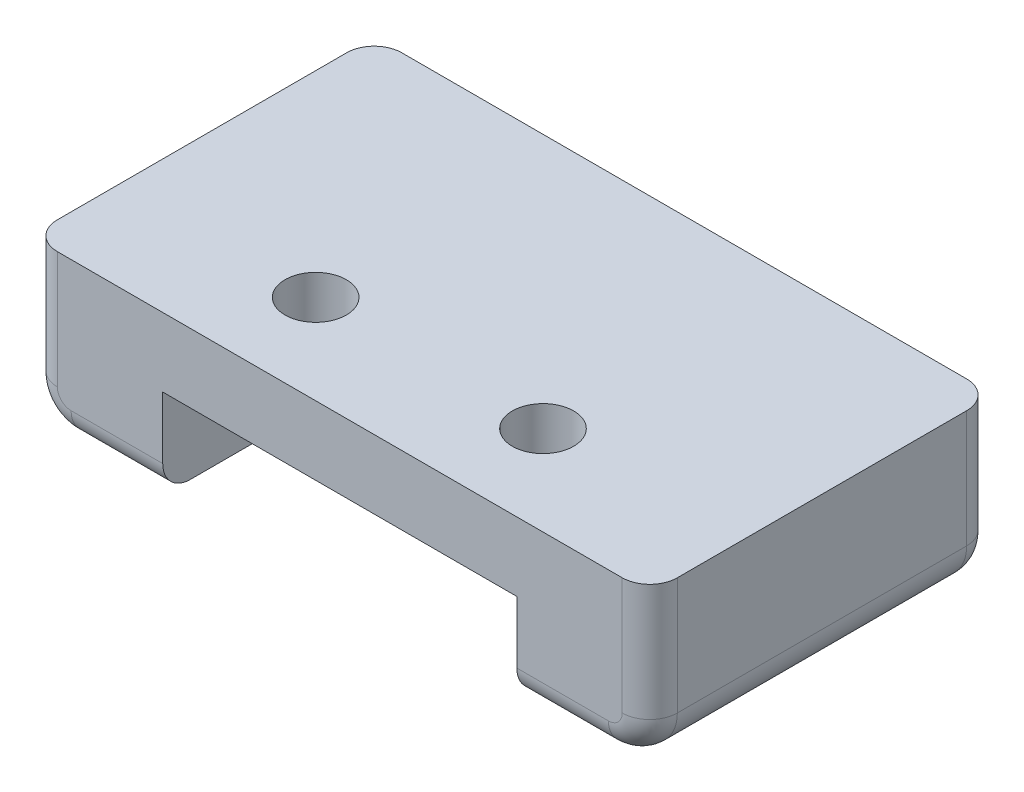
ISO-10303-21;
HEADER;
FILE_DESCRIPTION(('STEP AP214'),'2;1');
FILE_NAME('part.step','',(''),(''),'','','');
FILE_SCHEMA(('AUTOMOTIVE_DESIGN { 1 0 10303 214 1 1 1 1 }'));
ENDSEC;
DATA;
#1=APPLICATION_CONTEXT('core data for automotive mechanical design processes');
#2=APPLICATION_PROTOCOL_DEFINITION('international standard','automotive_design',2000,#1);
#3=PRODUCT_CONTEXT('',#1,'mechanical');
#4=PRODUCT('Part','Part','',(#3));
#5=PRODUCT_RELATED_PRODUCT_CATEGORY('part','',(#4));
#6=PRODUCT_DEFINITION_FORMATION('','',#4);
#7=PRODUCT_DEFINITION_CONTEXT('part definition',#1,'design');
#8=PRODUCT_DEFINITION('design','',#6,#7);
#9=PRODUCT_DEFINITION_SHAPE('','',#8);
#10=(LENGTH_UNIT() NAMED_UNIT(*) SI_UNIT(.MILLI.,.METRE.));
#11=(NAMED_UNIT(*) PLANE_ANGLE_UNIT() SI_UNIT($,.RADIAN.));
#12=(NAMED_UNIT(*) SI_UNIT($,.STERADIAN.) SOLID_ANGLE_UNIT());
#13=UNCERTAINTY_MEASURE_WITH_UNIT(LENGTH_MEASURE(1.E-05),#10,'distance_accuracy_value','');
#14=(GEOMETRIC_REPRESENTATION_CONTEXT(3) GLOBAL_UNCERTAINTY_ASSIGNED_CONTEXT((#13)) GLOBAL_UNIT_ASSIGNED_CONTEXT((#10,
#11,#12)) REPRESENTATION_CONTEXT('',''));
#15=CARTESIAN_POINT('',(0.,0.,0.));
#16=DIRECTION('',(0.,0.,1.));
#17=DIRECTION('',(1.,0.,0.));
#18=AXIS2_PLACEMENT_3D('',#15,#16,#17);
#19=CARTESIAN_POINT('',(-22.5,-6.5,25.));
#20=DIRECTION('',(1.,0.,0.));
#21=DIRECTION('',(0.,0.,-1.));
#22=AXIS2_PLACEMENT_3D('',#19,#20,#21);
#23=PLANE('',#22);
#24=DIRECTION('',(0.,0.,-1.));
#25=VECTOR('',#24,1.);
#26=CARTESIAN_POINT('',(-22.5,-3.5,25.));
#27=LINE('',#26,#25);
#28=CARTESIAN_POINT('',(-22.5,-3.5,2.));
#29=VERTEX_POINT('',#28);
#30=CARTESIAN_POINT('',(-22.5,-3.5,23.));
#31=VERTEX_POINT('',#30);
#32=EDGE_CURVE('E223',#29,#31,#27,.F.);
#33=ORIENTED_EDGE('',*,*,#32,.T.);
#34=DIRECTION('',(0.,-1.,0.));
#35=VECTOR('',#34,1.);
#36=CARTESIAN_POINT('',(-22.5,-6.5,23.));
#37=LINE('',#36,#35);
#38=CARTESIAN_POINT('',(-22.5,4.99999999999999,23.));
#39=VERTEX_POINT('',#38);
#40=EDGE_CURVE('E11',#31,#39,#37,.F.);
#41=ORIENTED_EDGE('',*,*,#40,.T.);
#42=DIRECTION('',(0.,0.,-1.));
#43=VECTOR('',#42,1.);
#44=CARTESIAN_POINT('',(-22.5,4.99999999999999,25.));
#45=LINE('',#44,#43);
#46=CARTESIAN_POINT('',(-22.5,4.99999999999999,2.));
#47=VERTEX_POINT('',#46);
#48=EDGE_CURVE('E195',#39,#47,#45,.T.);
#49=ORIENTED_EDGE('',*,*,#48,.T.);
#50=DIRECTION('',(0.,-1.,0.));
#51=VECTOR('',#50,1.);
#52=CARTESIAN_POINT('',(-22.5,-3.5,2.));
#53=LINE('',#52,#51);
#54=EDGE_CURVE('E43',#47,#29,#53,.T.);
#55=ORIENTED_EDGE('',*,*,#54,.T.);
#56=EDGE_LOOP('',(#33,#41,#49,#55));
#57=FACE_BOUND('',#56,.T.);
#58=ADVANCED_FACE('F34',(#57),#23,.F.);
#59=CARTESIAN_POINT('',(-12.85,-6.5,25.));
#60=DIRECTION('',(0.,1.,0.));
#61=DIRECTION('',(-1.,0.,0.));
#62=AXIS2_PLACEMENT_3D('',#59,#60,#61);
#63=PLANE('',#62);
#64=DIRECTION('',(0.,0.,-1.));
#65=VECTOR('',#64,1.);
#66=CARTESIAN_POINT('',(-12.85,-6.5,25.));
#67=LINE('',#66,#65);
#68=CARTESIAN_POINT('',(-12.85,-6.5,23.));
#69=VERTEX_POINT('',#68);
#70=CARTESIAN_POINT('',(-12.85,-6.5,2.));
#71=VERTEX_POINT('',#70);
#72=EDGE_CURVE('E181',#69,#71,#67,.T.);
#73=ORIENTED_EDGE('',*,*,#72,.F.);
#74=DIRECTION('',(1.,0.,0.));
#75=VECTOR('',#74,1.);
#76=CARTESIAN_POINT('',(-12.85,-6.5,23.));
#77=LINE('',#76,#75);
#78=CARTESIAN_POINT('',(-19.5,-6.5,23.));
#79=VERTEX_POINT('',#78);
#80=EDGE_CURVE('E258',#69,#79,#77,.F.);
#81=ORIENTED_EDGE('',*,*,#80,.T.);
#82=DIRECTION('',(0.,0.,-1.));
#83=VECTOR('',#82,1.);
#84=CARTESIAN_POINT('',(-19.5,-6.5,25.));
#85=LINE('',#84,#83);
#86=CARTESIAN_POINT('',(-19.5,-6.5,2.));
#87=VERTEX_POINT('',#86);
#88=EDGE_CURVE('E220',#79,#87,#85,.T.);
#89=ORIENTED_EDGE('',*,*,#88,.T.);
#90=DIRECTION('',(1.,0.,0.));
#91=VECTOR('',#90,1.);
#92=CARTESIAN_POINT('',(-12.85,-6.5,2.));
#93=LINE('',#92,#91);
#94=EDGE_CURVE('E255',#87,#71,#93,.T.);
#95=ORIENTED_EDGE('',*,*,#94,.T.);
#96=EDGE_LOOP('',(#73,#81,#89,#95));
#97=FACE_BOUND('',#96,.T.);
#98=ADVANCED_FACE('F341',(#97),#63,.F.);
#99=CARTESIAN_POINT('',(-12.85,0.,25.));
#100=DIRECTION('',(-1.,0.,0.));
#101=DIRECTION('',(0.,0.,1.));
#102=AXIS2_PLACEMENT_3D('',#99,#100,#101);
#103=PLANE('',#102);
#104=DIRECTION('',(0.,1.,0.));
#105=VECTOR('',#104,1.);
#106=CARTESIAN_POINT('',(-12.85,0.,25.));
#107=LINE('',#106,#105);
#108=CARTESIAN_POINT('',(-12.85,-4.5,25.));
#109=VERTEX_POINT('',#108);
#110=CARTESIAN_POINT('',(-12.85,0.,25.));
#111=VERTEX_POINT('',#110);
#112=EDGE_CURVE('E162',#109,#111,#107,.T.);
#113=ORIENTED_EDGE('',*,*,#112,.F.);
#114=CARTESIAN_POINT('',(-12.85,-4.5,23.));
#115=DIRECTION('',(-1.,0.,0.));
#116=DIRECTION('',(0.,0.,1.));
#117=AXIS2_PLACEMENT_3D('',#114,#115,#116);
#118=CIRCLE('',#117,2.);
#119=EDGE_CURVE('E253',#109,#69,#118,.F.);
#120=ORIENTED_EDGE('',*,*,#119,.T.);
#121=ORIENTED_EDGE('',*,*,#72,.T.);
#122=CARTESIAN_POINT('',(-12.85,-4.5,2.));
#123=DIRECTION('',(-1.,0.,0.));
#124=DIRECTION('',(0.,0.,1.));
#125=AXIS2_PLACEMENT_3D('',#122,#123,#124);
#126=CIRCLE('',#125,2.);
#127=CARTESIAN_POINT('',(-12.85,-4.5,0.));
#128=VERTEX_POINT('',#127);
#129=EDGE_CURVE('E251',#71,#128,#126,.F.);
#130=ORIENTED_EDGE('',*,*,#129,.T.);
#131=DIRECTION('',(0.,1.,0.));
#132=VECTOR('',#131,1.);
#133=CARTESIAN_POINT('',(-12.85,0.,0.));
#134=LINE('',#133,#132);
#135=CARTESIAN_POINT('',(-12.85,0.,0.));
#136=VERTEX_POINT('',#135);
#137=EDGE_CURVE('E178',#128,#136,#134,.T.);
#138=ORIENTED_EDGE('',*,*,#137,.T.);
#139=DIRECTION('',(0.,0.,-1.));
#140=VECTOR('',#139,1.);
#141=CARTESIAN_POINT('',(-12.85,0.,25.));
#142=LINE('',#141,#140);
#143=EDGE_CURVE('E175',#111,#136,#142,.T.);
#144=ORIENTED_EDGE('',*,*,#143,.F.);
#145=EDGE_LOOP('',(#113,#120,#121,#130,#138,#144));
#146=FACE_BOUND('',#145,.T.);
#147=ADVANCED_FACE('F176',(#146),#103,.F.);
#148=CARTESIAN_POINT('',(12.85,0.,25.));
#149=DIRECTION('',(0.,1.,0.));
#150=DIRECTION('',(0.,0.,1.));
#151=AXIS2_PLACEMENT_3D('',#148,#149,#150);
#152=PLANE('',#151);
#153=CARTESIAN_POINT('',(8.25,0.,18.5));
#154=DIRECTION('',(0.,1.,0.));
#155=DIRECTION('',(0.,0.,1.));
#156=AXIS2_PLACEMENT_3D('',#153,#154,#155);
#157=CIRCLE('',#156,2.225);
#158=CARTESIAN_POINT('',(8.25,0.,20.725));
#159=VERTEX_POINT('',#158);
#160=EDGE_CURVE('E607',#159,#159,#157,.T.);
#161=ORIENTED_EDGE('',*,*,#160,.T.);
#162=EDGE_LOOP('',(#161));
#163=FACE_BOUND('',#162,.T.);
#164=CARTESIAN_POINT('',(-8.25,0.,18.5));
#165=DIRECTION('',(0.,1.,0.));
#166=DIRECTION('',(0.,0.,1.));
#167=AXIS2_PLACEMENT_3D('',#164,#165,#166);
#168=CIRCLE('',#167,2.225);
#169=CARTESIAN_POINT('',(-8.25,0.,20.725));
#170=VERTEX_POINT('',#169);
#171=EDGE_CURVE('E198',#170,#170,#168,.T.);
#172=ORIENTED_EDGE('',*,*,#171,.T.);
#173=EDGE_LOOP('',(#172));
#174=FACE_BOUND('',#173,.T.);
#175=DIRECTION('',(1.,0.,0.));
#176=VECTOR('',#175,1.);
#177=CARTESIAN_POINT('',(12.85,0.,0.));
#178=LINE('',#177,#176);
#179=CARTESIAN_POINT('',(12.85,0.,0.));
#180=VERTEX_POINT('',#179);
#181=EDGE_CURVE('E197',#136,#180,#178,.T.);
#182=ORIENTED_EDGE('',*,*,#181,.T.);
#183=DIRECTION('',(0.,0.,-1.));
#184=VECTOR('',#183,1.);
#185=CARTESIAN_POINT('',(12.85,0.,25.));
#186=LINE('',#185,#184);
#187=CARTESIAN_POINT('',(12.85,0.,25.));
#188=VERTEX_POINT('',#187);
#189=EDGE_CURVE('E182',#188,#180,#186,.T.);
#190=ORIENTED_EDGE('',*,*,#189,.F.);
#191=DIRECTION('',(1.,0.,0.));
#192=VECTOR('',#191,1.);
#193=CARTESIAN_POINT('',(12.85,0.,25.));
#194=LINE('',#193,#192);
#195=EDGE_CURVE('E167',#111,#188,#194,.T.);
#196=ORIENTED_EDGE('',*,*,#195,.F.);
#197=ORIENTED_EDGE('',*,*,#143,.T.);
#198=EDGE_LOOP('',(#182,#190,#196,#197));
#199=FACE_BOUND('',#198,.T.);
#200=ADVANCED_FACE('F184',(#163,#174,#199),#152,.F.);
#201=CARTESIAN_POINT('',(12.85,-6.5,25.));
#202=DIRECTION('',(1.,0.,0.));
#203=DIRECTION('',(0.,0.,-1.));
#204=AXIS2_PLACEMENT_3D('',#201,#202,#203);
#205=PLANE('',#204);
#206=DIRECTION('',(0.,0.,-1.));
#207=VECTOR('',#206,1.);
#208=CARTESIAN_POINT('',(12.85,-6.5,25.));
#209=LINE('',#208,#207);
#210=CARTESIAN_POINT('',(12.85,-6.5,23.));
#211=VERTEX_POINT('',#210);
#212=CARTESIAN_POINT('',(12.85,-6.5,2.));
#213=VERTEX_POINT('',#212);
#214=EDGE_CURVE('E209',#211,#213,#209,.T.);
#215=ORIENTED_EDGE('',*,*,#214,.F.);
#216=CARTESIAN_POINT('',(12.85,-4.5,23.));
#217=DIRECTION('',(1.,0.,0.));
#218=DIRECTION('',(0.,0.,-1.));
#219=AXIS2_PLACEMENT_3D('',#216,#217,#218);
#220=CIRCLE('',#219,2.);
#221=CARTESIAN_POINT('',(12.85,-4.5,25.));
#222=VERTEX_POINT('',#221);
#223=EDGE_CURVE('E245',#211,#222,#220,.F.);
#224=ORIENTED_EDGE('',*,*,#223,.T.);
#225=DIRECTION('',(0.,-1.,0.));
#226=VECTOR('',#225,1.);
#227=CARTESIAN_POINT('',(12.85,-6.5,25.));
#228=LINE('',#227,#226);
#229=EDGE_CURVE('E187',#188,#222,#228,.T.);
#230=ORIENTED_EDGE('',*,*,#229,.F.);
#231=ORIENTED_EDGE('',*,*,#189,.T.);
#232=DIRECTION('',(0.,-1.,0.));
#233=VECTOR('',#232,1.);
#234=CARTESIAN_POINT('',(12.85,-6.5,0.));
#235=LINE('',#234,#233);
#236=CARTESIAN_POINT('',(12.85,-4.5,0.));
#237=VERTEX_POINT('',#236);
#238=EDGE_CURVE('E200',#180,#237,#235,.T.);
#239=ORIENTED_EDGE('',*,*,#238,.T.);
#240=CARTESIAN_POINT('',(12.85,-4.5,2.));
#241=DIRECTION('',(1.,0.,0.));
#242=DIRECTION('',(0.,0.,-1.));
#243=AXIS2_PLACEMENT_3D('',#240,#241,#242);
#244=CIRCLE('',#243,2.);
#245=EDGE_CURVE('E243',#237,#213,#244,.F.);
#246=ORIENTED_EDGE('',*,*,#245,.T.);
#247=EDGE_LOOP('',(#215,#224,#230,#231,#239,#246));
#248=FACE_BOUND('',#247,.T.);
#249=ADVANCED_FACE('F380',(#248),#205,.F.);
#250=CARTESIAN_POINT('',(22.5,-6.5,25.));
#251=DIRECTION('',(0.,1.,0.));
#252=DIRECTION('',(-1.,0.,0.));
#253=AXIS2_PLACEMENT_3D('',#250,#251,#252);
#254=PLANE('',#253);
#255=DIRECTION('',(0.,0.,-1.));
#256=VECTOR('',#255,1.);
#257=CARTESIAN_POINT('',(19.5,-6.5,25.));
#258=LINE('',#257,#256);
#259=CARTESIAN_POINT('',(19.5,-6.5,2.));
#260=VERTEX_POINT('',#259);
#261=CARTESIAN_POINT('',(19.5,-6.5,23.));
#262=VERTEX_POINT('',#261);
#263=EDGE_CURVE('E217',#260,#262,#258,.F.);
#264=ORIENTED_EDGE('',*,*,#263,.T.);
#265=DIRECTION('',(1.,0.,0.));
#266=VECTOR('',#265,1.);
#267=CARTESIAN_POINT('',(22.5,-6.5,23.));
#268=LINE('',#267,#266);
#269=EDGE_CURVE('E241',#262,#211,#268,.F.);
#270=ORIENTED_EDGE('',*,*,#269,.T.);
#271=ORIENTED_EDGE('',*,*,#214,.T.);
#272=DIRECTION('',(1.,0.,0.));
#273=VECTOR('',#272,1.);
#274=CARTESIAN_POINT('',(19.5,-6.5,2.));
#275=LINE('',#274,#273);
#276=EDGE_CURVE('E238',#213,#260,#275,.T.);
#277=ORIENTED_EDGE('',*,*,#276,.T.);
#278=EDGE_LOOP('',(#264,#270,#271,#277));
#279=FACE_BOUND('',#278,.T.);
#280=ADVANCED_FACE('F373',(#279),#254,.F.);
#281=CARTESIAN_POINT('',(22.5,4.99999999999999,25.));
#282=DIRECTION('',(-1.,0.,0.));
#283=DIRECTION('',(0.,0.,1.));
#284=AXIS2_PLACEMENT_3D('',#281,#282,#283);
#285=PLANE('',#284);
#286=DIRECTION('',(0.,0.,-1.));
#287=VECTOR('',#286,1.);
#288=CARTESIAN_POINT('',(22.5,4.99999999999999,25.));
#289=LINE('',#288,#287);
#290=CARTESIAN_POINT('',(22.5,4.99999999999999,23.));
#291=VERTEX_POINT('',#290);
#292=CARTESIAN_POINT('',(22.5,4.99999999999999,2.));
#293=VERTEX_POINT('',#292);
#294=EDGE_CURVE('E207',#291,#293,#289,.T.);
#295=ORIENTED_EDGE('',*,*,#294,.F.);
#296=DIRECTION('',(0.,1.,0.));
#297=VECTOR('',#296,1.);
#298=CARTESIAN_POINT('',(22.5,4.99999999999999,23.));
#299=LINE('',#298,#297);
#300=CARTESIAN_POINT('',(22.5,-3.5,23.));
#301=VERTEX_POINT('',#300);
#302=EDGE_CURVE('E284',#291,#301,#299,.F.);
#303=ORIENTED_EDGE('',*,*,#302,.T.);
#304=DIRECTION('',(0.,0.,-1.));
#305=VECTOR('',#304,1.);
#306=CARTESIAN_POINT('',(22.5,-3.5,25.));
#307=LINE('',#306,#305);
#308=CARTESIAN_POINT('',(22.5,-3.5,2.));
#309=VERTEX_POINT('',#308);
#310=EDGE_CURVE('E215',#301,#309,#307,.T.);
#311=ORIENTED_EDGE('',*,*,#310,.T.);
#312=DIRECTION('',(0.,1.,0.));
#313=VECTOR('',#312,1.);
#314=CARTESIAN_POINT('',(22.5,4.99999999999999,2.));
#315=LINE('',#314,#313);
#316=EDGE_CURVE('E51',#309,#293,#315,.T.);
#317=ORIENTED_EDGE('',*,*,#316,.T.);
#318=EDGE_LOOP('',(#295,#303,#311,#317));
#319=FACE_BOUND('',#318,.T.);
#320=ADVANCED_FACE('F543',(#319),#285,.F.);
#321=CARTESIAN_POINT('',(-22.5,4.99999999999999,25.));
#322=DIRECTION('',(0.,-1.,0.));
#323=DIRECTION('',(0.,0.,-1.));
#324=AXIS2_PLACEMENT_3D('',#321,#322,#323);
#325=PLANE('',#324);
#326=CARTESIAN_POINT('',(8.25,4.99999999999999,18.5));
#327=DIRECTION('',(0.,1.,0.));
#328=DIRECTION('',(0.,0.,1.));
#329=AXIS2_PLACEMENT_3D('',#326,#327,#328);
#330=CIRCLE('',#329,2.225);
#331=CARTESIAN_POINT('',(8.25,4.99999999999999,20.725));
#332=VERTEX_POINT('',#331);
#333=EDGE_CURVE('E293',#332,#332,#330,.T.);
#334=ORIENTED_EDGE('',*,*,#333,.F.);
#335=EDGE_LOOP('',(#334));
#336=FACE_BOUND('',#335,.T.);
#337=CARTESIAN_POINT('',(-8.25,4.99999999999999,18.5));
#338=DIRECTION('',(0.,1.,0.));
#339=DIRECTION('',(0.,0.,1.));
#340=AXIS2_PLACEMENT_3D('',#337,#338,#339);
#341=CIRCLE('',#340,2.225);
#342=CARTESIAN_POINT('',(-8.25,4.99999999999999,20.725));
#343=VERTEX_POINT('',#342);
#344=EDGE_CURVE('E611',#343,#343,#341,.T.);
#345=ORIENTED_EDGE('',*,*,#344,.F.);
#346=EDGE_LOOP('',(#345));
#347=FACE_BOUND('',#346,.T.);
#348=DIRECTION('',(-1.,0.,0.));
#349=VECTOR('',#348,1.);
#350=CARTESIAN_POINT('',(-22.5,4.99999999999999,25.));
#351=LINE('',#350,#349);
#352=CARTESIAN_POINT('',(20.5,4.99999999999999,25.));
#353=VERTEX_POINT('',#352);
#354=CARTESIAN_POINT('',(-20.5,4.99999999999999,25.));
#355=VERTEX_POINT('',#354);
#356=EDGE_CURVE('E189',#353,#355,#351,.T.);
#357=ORIENTED_EDGE('',*,*,#356,.F.);
#358=CARTESIAN_POINT('',(20.5,4.99999999999999,23.));
#359=DIRECTION('',(0.,-1.,0.));
#360=DIRECTION('',(0.,0.,-1.));
#361=AXIS2_PLACEMENT_3D('',#358,#359,#360);
#362=CIRCLE('',#361,2.);
#363=EDGE_CURVE('E58',#353,#291,#362,.F.);
#364=ORIENTED_EDGE('',*,*,#363,.T.);
#365=ORIENTED_EDGE('',*,*,#294,.T.);
#366=CARTESIAN_POINT('',(20.5,4.99999999999999,2.));
#367=DIRECTION('',(0.,-1.,0.));
#368=DIRECTION('',(0.,0.,-1.));
#369=AXIS2_PLACEMENT_3D('',#366,#367,#368);
#370=CIRCLE('',#369,2.);
#371=CARTESIAN_POINT('',(20.5,4.99999999999999,0.));
#372=VERTEX_POINT('',#371);
#373=EDGE_CURVE('E276',#293,#372,#370,.F.);
#374=ORIENTED_EDGE('',*,*,#373,.T.);
#375=DIRECTION('',(-1.,0.,0.));
#376=VECTOR('',#375,1.);
#377=CARTESIAN_POINT('',(-22.5,4.99999999999999,0.));
#378=LINE('',#377,#376);
#379=CARTESIAN_POINT('',(-20.5,4.99999999999999,0.));
#380=VERTEX_POINT('',#379);
#381=EDGE_CURVE('E172',#372,#380,#378,.T.);
#382=ORIENTED_EDGE('',*,*,#381,.T.);
#383=CARTESIAN_POINT('',(-20.5,4.99999999999999,2.));
#384=DIRECTION('',(0.,-1.,0.));
#385=DIRECTION('',(0.,0.,-1.));
#386=AXIS2_PLACEMENT_3D('',#383,#384,#385);
#387=CIRCLE('',#386,2.);
#388=EDGE_CURVE('E278',#380,#47,#387,.F.);
#389=ORIENTED_EDGE('',*,*,#388,.T.);
#390=ORIENTED_EDGE('',*,*,#48,.F.);
#391=CARTESIAN_POINT('',(-20.5,4.99999999999999,23.));
#392=DIRECTION('',(0.,-1.,0.));
#393=DIRECTION('',(0.,0.,-1.));
#394=AXIS2_PLACEMENT_3D('',#391,#392,#393);
#395=CIRCLE('',#394,2.);
#396=EDGE_CURVE('E280',#39,#355,#395,.F.);
#397=ORIENTED_EDGE('',*,*,#396,.T.);
#398=EDGE_LOOP('',(#357,#364,#365,#374,#382,#389,#390,#397));
#399=FACE_BOUND('',#398,.T.);
#400=ADVANCED_FACE('F319',(#336,#347,#399),#325,.F.);
#401=CARTESIAN_POINT('',(0.,0.,25.));
#402=DIRECTION('',(0.,0.,-1.));
#403=DIRECTION('',(-1.,0.,0.));
#404=AXIS2_PLACEMENT_3D('',#401,#402,#403);
#405=PLANE('',#404);
#406=ORIENTED_EDGE('',*,*,#229,.T.);
#407=DIRECTION('',(1.,0.,0.));
#408=VECTOR('',#407,1.);
#409=CARTESIAN_POINT('',(0.,-4.5,25.));
#410=LINE('',#409,#408);
#411=CARTESIAN_POINT('',(19.5,-4.5,25.));
#412=VERTEX_POINT('',#411);
#413=EDGE_CURVE('E235',#222,#412,#410,.T.);
#414=ORIENTED_EDGE('',*,*,#413,.T.);
#415=CARTESIAN_POINT('',(19.5,-3.5,25.));
#416=DIRECTION('',(0.,0.,-1.));
#417=DIRECTION('',(-1.,0.,0.));
#418=AXIS2_PLACEMENT_3D('',#415,#416,#417);
#419=CIRCLE('',#418,1.);
#420=CARTESIAN_POINT('',(20.5,-3.5,25.));
#421=VERTEX_POINT('',#420);
#422=EDGE_CURVE('E233',#412,#421,#419,.F.);
#423=ORIENTED_EDGE('',*,*,#422,.T.);
#424=DIRECTION('',(0.,1.,0.));
#425=VECTOR('',#424,1.);
#426=CARTESIAN_POINT('',(20.5,0.,25.));
#427=LINE('',#426,#425);
#428=EDGE_CURVE('E231',#421,#353,#427,.T.);
#429=ORIENTED_EDGE('',*,*,#428,.T.);
#430=ORIENTED_EDGE('',*,*,#356,.T.);
#431=DIRECTION('',(0.,-1.,0.));
#432=VECTOR('',#431,1.);
#433=CARTESIAN_POINT('',(-20.5,0.,25.));
#434=LINE('',#433,#432);
#435=CARTESIAN_POINT('',(-20.5,-3.5,25.));
#436=VERTEX_POINT('',#435);
#437=EDGE_CURVE('E226',#355,#436,#434,.T.);
#438=ORIENTED_EDGE('',*,*,#437,.T.);
#439=CARTESIAN_POINT('',(-19.5,-3.5,25.));
#440=DIRECTION('',(0.,0.,-1.));
#441=DIRECTION('',(-1.,0.,0.));
#442=AXIS2_PLACEMENT_3D('',#439,#440,#441);
#443=CIRCLE('',#442,1.);
#444=CARTESIAN_POINT('',(-19.5,-4.5,25.));
#445=VERTEX_POINT('',#444);
#446=EDGE_CURVE('E228',#436,#445,#443,.F.);
#447=ORIENTED_EDGE('',*,*,#446,.T.);
#448=DIRECTION('',(1.,0.,0.));
#449=VECTOR('',#448,1.);
#450=CARTESIAN_POINT('',(0.,-4.5,25.));
#451=LINE('',#450,#449);
#452=EDGE_CURVE('E170',#445,#109,#451,.T.);
#453=ORIENTED_EDGE('',*,*,#452,.T.);
#454=ORIENTED_EDGE('',*,*,#112,.T.);
#455=ORIENTED_EDGE('',*,*,#195,.T.);
#456=EDGE_LOOP('',(#406,#414,#423,#429,#430,#438,#447,#453,#454,#455));
#457=FACE_BOUND('',#456,.T.);
#458=ADVANCED_FACE('F165',(#457),#405,.F.);
#459=CARTESIAN_POINT('',(0.,0.,0.));
#460=DIRECTION('',(0.,0.,-1.));
#461=DIRECTION('',(-1.,0.,0.));
#462=AXIS2_PLACEMENT_3D('',#459,#460,#461);
#463=PLANE('',#462);
#464=ORIENTED_EDGE('',*,*,#137,.F.);
#465=DIRECTION('',(1.,0.,0.));
#466=VECTOR('',#465,1.);
#467=CARTESIAN_POINT('',(-19.5,-4.5,0.));
#468=LINE('',#467,#466);
#469=CARTESIAN_POINT('',(-19.5,-4.5,0.));
#470=VERTEX_POINT('',#469);
#471=EDGE_CURVE('E274',#128,#470,#468,.F.);
#472=ORIENTED_EDGE('',*,*,#471,.T.);
#473=CARTESIAN_POINT('',(-19.5,-3.5,0.));
#474=DIRECTION('',(0.,0.,-1.));
#475=DIRECTION('',(-1.,0.,0.));
#476=AXIS2_PLACEMENT_3D('',#473,#474,#475);
#477=CIRCLE('',#476,1.);
#478=CARTESIAN_POINT('',(-20.5,-3.5,0.));
#479=VERTEX_POINT('',#478);
#480=EDGE_CURVE('E272',#470,#479,#477,.T.);
#481=ORIENTED_EDGE('',*,*,#480,.T.);
#482=DIRECTION('',(0.,-1.,0.));
#483=VECTOR('',#482,1.);
#484=CARTESIAN_POINT('',(-20.5,4.99999999999999,0.));
#485=LINE('',#484,#483);
#486=EDGE_CURVE('E270',#479,#380,#485,.F.);
#487=ORIENTED_EDGE('',*,*,#486,.T.);
#488=ORIENTED_EDGE('',*,*,#381,.F.);
#489=DIRECTION('',(0.,1.,0.));
#490=VECTOR('',#489,1.);
#491=CARTESIAN_POINT('',(20.5,-3.5,0.));
#492=LINE('',#491,#490);
#493=CARTESIAN_POINT('',(20.5,-3.5,0.));
#494=VERTEX_POINT('',#493);
#495=EDGE_CURVE('E264',#372,#494,#492,.F.);
#496=ORIENTED_EDGE('',*,*,#495,.T.);
#497=CARTESIAN_POINT('',(19.5,-3.5,0.));
#498=DIRECTION('',(0.,0.,-1.));
#499=DIRECTION('',(-1.,0.,0.));
#500=AXIS2_PLACEMENT_3D('',#497,#498,#499);
#501=CIRCLE('',#500,1.);
#502=CARTESIAN_POINT('',(19.5,-4.5,0.));
#503=VERTEX_POINT('',#502);
#504=EDGE_CURVE('E266',#494,#503,#501,.T.);
#505=ORIENTED_EDGE('',*,*,#504,.T.);
#506=DIRECTION('',(1.,0.,0.));
#507=VECTOR('',#506,1.);
#508=CARTESIAN_POINT('',(12.85,-4.5,0.));
#509=LINE('',#508,#507);
#510=EDGE_CURVE('E268',#503,#237,#509,.F.);
#511=ORIENTED_EDGE('',*,*,#510,.T.);
#512=ORIENTED_EDGE('',*,*,#238,.F.);
#513=ORIENTED_EDGE('',*,*,#181,.F.);
#514=EDGE_LOOP('',(#464,#472,#481,#487,#488,#496,#505,#511,#512,#513));
#515=FACE_BOUND('',#514,.T.);
#516=ADVANCED_FACE('F322',(#515),#463,.T.);
#517=CARTESIAN_POINT('',(-8.25,-6.5,18.5));
#518=DIRECTION('',(0.,1.,0.));
#519=DIRECTION('',(0.,0.,1.));
#520=AXIS2_PLACEMENT_3D('',#517,#518,#519);
#521=CYLINDRICAL_SURFACE('',#520,2.225);
#522=ORIENTED_EDGE('',*,*,#344,.T.);
#523=EDGE_LOOP('',(#522));
#524=FACE_BOUND('',#523,.T.);
#525=ORIENTED_EDGE('',*,*,#171,.F.);
#526=EDGE_LOOP('',(#525));
#527=FACE_BOUND('',#526,.T.);
#528=ADVANCED_FACE('F512',(#524,#527),#521,.F.);
#529=CARTESIAN_POINT('',(8.25,-6.5,18.5));
#530=DIRECTION('',(0.,1.,0.));
#531=DIRECTION('',(0.,0.,1.));
#532=AXIS2_PLACEMENT_3D('',#529,#530,#531);
#533=CYLINDRICAL_SURFACE('',#532,2.225);
#534=ORIENTED_EDGE('',*,*,#333,.T.);
#535=EDGE_LOOP('',(#534));
#536=FACE_BOUND('',#535,.T.);
#537=ORIENTED_EDGE('',*,*,#160,.F.);
#538=EDGE_LOOP('',(#537));
#539=FACE_BOUND('',#538,.T.);
#540=ADVANCED_FACE('F405',(#536,#539),#533,.F.);
#541=CARTESIAN_POINT('',(19.5,-3.5,25.));
#542=DIRECTION('',(0.,0.,-1.));
#543=DIRECTION('',(-1.,0.,0.));
#544=AXIS2_PLACEMENT_3D('',#541,#542,#543);
#545=CYLINDRICAL_SURFACE('',#544,3.);
#546=ORIENTED_EDGE('',*,*,#310,.F.);
#547=CARTESIAN_POINT('',(19.5,-3.5,23.));
#548=DIRECTION('',(0.,0.,-1.));
#549=DIRECTION('',(-1.,0.,0.));
#550=AXIS2_PLACEMENT_3D('',#547,#548,#549);
#551=CIRCLE('',#550,3.);
#552=EDGE_CURVE('E249',#301,#262,#551,.T.);
#553=ORIENTED_EDGE('',*,*,#552,.T.);
#554=ORIENTED_EDGE('',*,*,#263,.F.);
#555=CARTESIAN_POINT('',(19.5,-3.5,2.));
#556=DIRECTION('',(0.,0.,-1.));
#557=DIRECTION('',(-1.,0.,0.));
#558=AXIS2_PLACEMENT_3D('',#555,#556,#557);
#559=CIRCLE('',#558,3.);
#560=EDGE_CURVE('E247',#260,#309,#559,.F.);
#561=ORIENTED_EDGE('',*,*,#560,.T.);
#562=EDGE_LOOP('',(#546,#553,#554,#561));
#563=FACE_BOUND('',#562,.T.);
#564=ADVANCED_FACE('F370',(#563),#545,.T.);
#565=CARTESIAN_POINT('',(-19.5,-3.5,25.));
#566=DIRECTION('',(0.,0.,-1.));
#567=DIRECTION('',(-1.,0.,0.));
#568=AXIS2_PLACEMENT_3D('',#565,#566,#567);
#569=CYLINDRICAL_SURFACE('',#568,3.);
#570=ORIENTED_EDGE('',*,*,#88,.F.);
#571=CARTESIAN_POINT('',(-19.5,-3.5,23.));
#572=DIRECTION('',(0.,0.,-1.));
#573=DIRECTION('',(-1.,0.,0.));
#574=AXIS2_PLACEMENT_3D('',#571,#572,#573);
#575=CIRCLE('',#574,3.);
#576=EDGE_CURVE('E262',#79,#31,#575,.T.);
#577=ORIENTED_EDGE('',*,*,#576,.T.);
#578=ORIENTED_EDGE('',*,*,#32,.F.);
#579=CARTESIAN_POINT('',(-19.5,-3.5,2.));
#580=DIRECTION('',(0.,0.,-1.));
#581=DIRECTION('',(-1.,0.,0.));
#582=AXIS2_PLACEMENT_3D('',#579,#580,#581);
#583=CIRCLE('',#582,3.);
#584=EDGE_CURVE('E260',#29,#87,#583,.F.);
#585=ORIENTED_EDGE('',*,*,#584,.T.);
#586=EDGE_LOOP('',(#570,#577,#578,#585));
#587=FACE_BOUND('',#586,.T.);
#588=ADVANCED_FACE('F337',(#587),#569,.T.);
#589=CARTESIAN_POINT('',(20.5,0.,23.));
#590=DIRECTION('',(0.,1.,0.));
#591=DIRECTION('',(0.,0.,1.));
#592=AXIS2_PLACEMENT_3D('',#589,#590,#591);
#593=CYLINDRICAL_SURFACE('',#592,2.);
#594=ORIENTED_EDGE('',*,*,#363,.F.);
#595=ORIENTED_EDGE('',*,*,#428,.F.);
#596=CARTESIAN_POINT('',(20.5,-3.5,23.));
#597=DIRECTION('',(0.,-1.,0.));
#598=DIRECTION('',(0.,0.,-1.));
#599=AXIS2_PLACEMENT_3D('',#596,#597,#598);
#600=CIRCLE('',#599,2.);
#601=EDGE_CURVE('E289',#301,#421,#600,.T.);
#602=ORIENTED_EDGE('',*,*,#601,.F.);
#603=ORIENTED_EDGE('',*,*,#302,.F.);
#604=EDGE_LOOP('',(#594,#595,#602,#603));
#605=FACE_BOUND('',#604,.T.);
#606=ADVANCED_FACE('F361',(#605),#593,.T.);
#607=CARTESIAN_POINT('',(19.5,-3.5,23.));
#608=DIRECTION('',(0.,0.,-1.));
#609=DIRECTION('',(-1.,0.,0.));
#610=AXIS2_PLACEMENT_3D('',#607,#608,#609);
#611=DEGENERATE_TOROIDAL_SURFACE('',#610,1.,2.,.T.);
#612=ORIENTED_EDGE('',*,*,#601,.T.);
#613=ORIENTED_EDGE('',*,*,#422,.F.);
#614=CARTESIAN_POINT('',(19.5,-4.5,23.));
#615=DIRECTION('',(-1.,0.,0.));
#616=DIRECTION('',(0.,0.,1.));
#617=AXIS2_PLACEMENT_3D('',#614,#615,#616);
#618=CIRCLE('',#617,2.);
#619=EDGE_CURVE('E287',#262,#412,#618,.T.);
#620=ORIENTED_EDGE('',*,*,#619,.F.);
#621=ORIENTED_EDGE('',*,*,#552,.F.);
#622=EDGE_LOOP('',(#612,#613,#620,#621));
#623=FACE_BOUND('',#622,.T.);
#624=ADVANCED_FACE('F365',(#623),#611,.T.);
#625=CARTESIAN_POINT('',(0.,-4.5,23.));
#626=DIRECTION('',(1.,0.,0.));
#627=DIRECTION('',(0.,1.,0.));
#628=AXIS2_PLACEMENT_3D('',#625,#626,#627);
#629=CYLINDRICAL_SURFACE('',#628,2.);
#630=ORIENTED_EDGE('',*,*,#223,.F.);
#631=ORIENTED_EDGE('',*,*,#269,.F.);
#632=ORIENTED_EDGE('',*,*,#619,.T.);
#633=ORIENTED_EDGE('',*,*,#413,.F.);
#634=EDGE_LOOP('',(#630,#631,#632,#633));
#635=FACE_BOUND('',#634,.T.);
#636=ADVANCED_FACE('F377',(#635),#629,.T.);
#637=CARTESIAN_POINT('',(-20.5,0.,23.));
#638=DIRECTION('',(0.,-1.,0.));
#639=DIRECTION('',(0.,0.,-1.));
#640=AXIS2_PLACEMENT_3D('',#637,#638,#639);
#641=CYLINDRICAL_SURFACE('',#640,2.);
#642=ORIENTED_EDGE('',*,*,#396,.F.);
#643=ORIENTED_EDGE('',*,*,#40,.F.);
#644=CARTESIAN_POINT('',(-20.5,-3.5,23.));
#645=DIRECTION('',(0.,-1.,0.));
#646=DIRECTION('',(0.,0.,-1.));
#647=AXIS2_PLACEMENT_3D('',#644,#645,#646);
#648=CIRCLE('',#647,2.);
#649=EDGE_CURVE('E290',#436,#31,#648,.T.);
#650=ORIENTED_EDGE('',*,*,#649,.F.);
#651=ORIENTED_EDGE('',*,*,#437,.F.);
#652=EDGE_LOOP('',(#642,#643,#650,#651));
#653=FACE_BOUND('',#652,.T.);
#654=ADVANCED_FACE('F355',(#653),#641,.T.);
#655=CARTESIAN_POINT('',(-19.5,-3.5,23.));
#656=DIRECTION('',(0.,0.,-1.));
#657=DIRECTION('',(-1.,0.,0.));
#658=AXIS2_PLACEMENT_3D('',#655,#656,#657);
#659=DEGENERATE_TOROIDAL_SURFACE('',#658,1.,2.,.T.);
#660=ORIENTED_EDGE('',*,*,#649,.T.);
#661=ORIENTED_EDGE('',*,*,#576,.F.);
#662=CARTESIAN_POINT('',(-19.5,-4.5,23.));
#663=DIRECTION('',(1.,0.,0.));
#664=DIRECTION('',(0.,0.,-1.));
#665=AXIS2_PLACEMENT_3D('',#662,#663,#664);
#666=CIRCLE('',#665,2.);
#667=EDGE_CURVE('E294',#445,#79,#666,.T.);
#668=ORIENTED_EDGE('',*,*,#667,.F.);
#669=ORIENTED_EDGE('',*,*,#446,.F.);
#670=EDGE_LOOP('',(#660,#661,#668,#669));
#671=FACE_BOUND('',#670,.T.);
#672=ADVANCED_FACE('F348',(#671),#659,.T.);
#673=CARTESIAN_POINT('',(0.,-4.5,23.));
#674=DIRECTION('',(1.,0.,0.));
#675=DIRECTION('',(0.,1.,0.));
#676=AXIS2_PLACEMENT_3D('',#673,#674,#675);
#677=CYLINDRICAL_SURFACE('',#676,2.);
#678=ORIENTED_EDGE('',*,*,#667,.T.);
#679=ORIENTED_EDGE('',*,*,#80,.F.);
#680=ORIENTED_EDGE('',*,*,#119,.F.);
#681=ORIENTED_EDGE('',*,*,#452,.F.);
#682=EDGE_LOOP('',(#678,#679,#680,#681));
#683=FACE_BOUND('',#682,.T.);
#684=ADVANCED_FACE('F344',(#683),#677,.T.);
#685=CARTESIAN_POINT('',(-20.5,-6.5,2.));
#686=DIRECTION('',(0.,1.,0.));
#687=DIRECTION('',(0.,0.,1.));
#688=AXIS2_PLACEMENT_3D('',#685,#686,#687);
#689=CYLINDRICAL_SURFACE('',#688,2.);
#690=ORIENTED_EDGE('',*,*,#388,.F.);
#691=ORIENTED_EDGE('',*,*,#486,.F.);
#692=CARTESIAN_POINT('',(-20.5,-3.5,2.));
#693=DIRECTION('',(0.,-1.,0.));
#694=DIRECTION('',(0.,0.,-1.));
#695=AXIS2_PLACEMENT_3D('',#692,#693,#694);
#696=CIRCLE('',#695,2.);
#697=EDGE_CURVE('E297',#29,#479,#696,.T.);
#698=ORIENTED_EDGE('',*,*,#697,.F.);
#699=ORIENTED_EDGE('',*,*,#54,.F.);
#700=EDGE_LOOP('',(#690,#691,#698,#699));
#701=FACE_BOUND('',#700,.T.);
#702=ADVANCED_FACE('F327',(#701),#689,.T.);
#703=CARTESIAN_POINT('',(-19.5,-3.5,2.));
#704=DIRECTION('',(0.,0.,-1.));
#705=DIRECTION('',(-1.,0.,0.));
#706=AXIS2_PLACEMENT_3D('',#703,#704,#705);
#707=DEGENERATE_TOROIDAL_SURFACE('',#706,1.,2.,.T.);
#708=ORIENTED_EDGE('',*,*,#697,.T.);
#709=ORIENTED_EDGE('',*,*,#480,.F.);
#710=CARTESIAN_POINT('',(-19.5,-4.5,2.));
#711=DIRECTION('',(1.,0.,0.));
#712=DIRECTION('',(0.,0.,-1.));
#713=AXIS2_PLACEMENT_3D('',#710,#711,#712);
#714=CIRCLE('',#713,2.);
#715=EDGE_CURVE('E300',#87,#470,#714,.T.);
#716=ORIENTED_EDGE('',*,*,#715,.F.);
#717=ORIENTED_EDGE('',*,*,#584,.F.);
#718=EDGE_LOOP('',(#708,#709,#716,#717));
#719=FACE_BOUND('',#718,.T.);
#720=ADVANCED_FACE('F331',(#719),#707,.T.);
#721=CARTESIAN_POINT('',(-12.85,-4.5,2.));
#722=DIRECTION('',(-1.,0.,0.));
#723=DIRECTION('',(0.,-1.,0.));
#724=AXIS2_PLACEMENT_3D('',#721,#722,#723);
#725=CYLINDRICAL_SURFACE('',#724,2.);
#726=ORIENTED_EDGE('',*,*,#715,.T.);
#727=ORIENTED_EDGE('',*,*,#471,.F.);
#728=ORIENTED_EDGE('',*,*,#129,.F.);
#729=ORIENTED_EDGE('',*,*,#94,.F.);
#730=EDGE_LOOP('',(#726,#727,#728,#729));
#731=FACE_BOUND('',#730,.T.);
#732=ADVANCED_FACE('F386',(#731),#725,.T.);
#733=CARTESIAN_POINT('',(20.5,4.99999999999999,2.));
#734=DIRECTION('',(0.,-1.,0.));
#735=DIRECTION('',(0.,0.,-1.));
#736=AXIS2_PLACEMENT_3D('',#733,#734,#735);
#737=CYLINDRICAL_SURFACE('',#736,2.);
#738=ORIENTED_EDGE('',*,*,#373,.F.);
#739=ORIENTED_EDGE('',*,*,#316,.F.);
#740=CARTESIAN_POINT('',(20.5,-3.5,2.));
#741=DIRECTION('',(0.,-1.,0.));
#742=DIRECTION('',(0.,0.,-1.));
#743=AXIS2_PLACEMENT_3D('',#740,#741,#742);
#744=CIRCLE('',#743,2.);
#745=EDGE_CURVE('E38',#494,#309,#744,.T.);
#746=ORIENTED_EDGE('',*,*,#745,.F.);
#747=ORIENTED_EDGE('',*,*,#495,.F.);
#748=EDGE_LOOP('',(#738,#739,#746,#747));
#749=FACE_BOUND('',#748,.T.);
#750=ADVANCED_FACE('F36',(#749),#737,.T.);
#751=CARTESIAN_POINT('',(19.5,-3.5,2.));
#752=DIRECTION('',(0.,0.,-1.));
#753=DIRECTION('',(-1.,0.,0.));
#754=AXIS2_PLACEMENT_3D('',#751,#752,#753);
#755=DEGENERATE_TOROIDAL_SURFACE('',#754,1.,2.,.T.);
#756=ORIENTED_EDGE('',*,*,#745,.T.);
#757=ORIENTED_EDGE('',*,*,#560,.F.);
#758=CARTESIAN_POINT('',(19.5,-4.5,2.));
#759=DIRECTION('',(-1.,0.,0.));
#760=DIRECTION('',(0.,0.,1.));
#761=AXIS2_PLACEMENT_3D('',#758,#759,#760);
#762=CIRCLE('',#761,2.);
#763=EDGE_CURVE('E304',#503,#260,#762,.T.);
#764=ORIENTED_EDGE('',*,*,#763,.F.);
#765=ORIENTED_EDGE('',*,*,#504,.F.);
#766=EDGE_LOOP('',(#756,#757,#764,#765));
#767=FACE_BOUND('',#766,.T.);
#768=ADVANCED_FACE('F314',(#767),#755,.T.);
#769=CARTESIAN_POINT('',(22.5,-4.5,2.));
#770=DIRECTION('',(-1.,0.,0.));
#771=DIRECTION('',(0.,-1.,0.));
#772=AXIS2_PLACEMENT_3D('',#769,#770,#771);
#773=CYLINDRICAL_SURFACE('',#772,2.);
#774=ORIENTED_EDGE('',*,*,#245,.F.);
#775=ORIENTED_EDGE('',*,*,#510,.F.);
#776=ORIENTED_EDGE('',*,*,#763,.T.);
#777=ORIENTED_EDGE('',*,*,#276,.F.);
#778=EDGE_LOOP('',(#774,#775,#776,#777));
#779=FACE_BOUND('',#778,.T.);
#780=ADVANCED_FACE('F382',(#779),#773,.T.);
#781=CLOSED_SHELL('',(#58,#98,#147,#200,#249,#280,#320,#400,#458,#516,#528,#540,#564,#588,#606,
#624,#636,#654,#672,#684,#702,#720,#732,#750,#768,#780));
#782=MANIFOLD_SOLID_BREP('B2',#781);
#783=ADVANCED_BREP_SHAPE_REPRESENTATION('',(#18,#782),#14);
#784=SHAPE_DEFINITION_REPRESENTATION(#9,#783);
ENDSEC;
END-ISO-10303-21;
